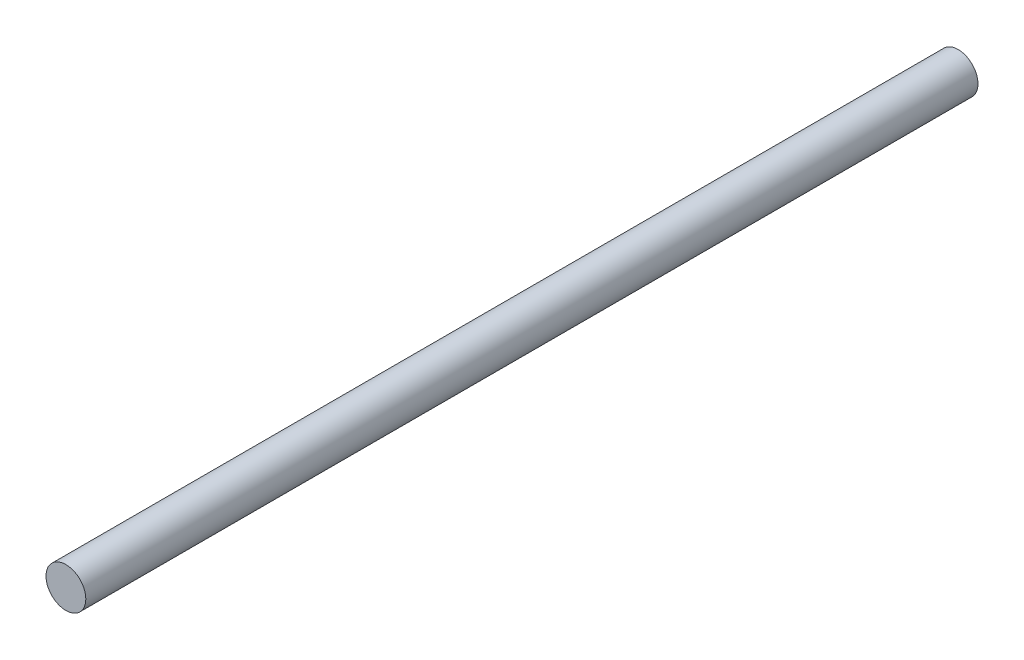
ISO-10303-21;
HEADER;
FILE_DESCRIPTION(('STEP AP214'),'2;1');
FILE_NAME('part.step','',(''),(''),'','','');
FILE_SCHEMA(('AUTOMOTIVE_DESIGN { 1 0 10303 214 1 1 1 1 }'));
ENDSEC;
DATA;
#1=APPLICATION_CONTEXT('core data for automotive mechanical design processes');
#2=APPLICATION_PROTOCOL_DEFINITION('international standard','automotive_design',2000,#1);
#3=PRODUCT_CONTEXT('',#1,'mechanical');
#4=PRODUCT('Part','Part','',(#3));
#5=PRODUCT_RELATED_PRODUCT_CATEGORY('part','',(#4));
#6=PRODUCT_DEFINITION_FORMATION('','',#4);
#7=PRODUCT_DEFINITION_CONTEXT('part definition',#1,'design');
#8=PRODUCT_DEFINITION('design','',#6,#7);
#9=PRODUCT_DEFINITION_SHAPE('','',#8);
#10=(LENGTH_UNIT() NAMED_UNIT(*) SI_UNIT(.MILLI.,.METRE.));
#11=(NAMED_UNIT(*) PLANE_ANGLE_UNIT() SI_UNIT($,.RADIAN.));
#12=(NAMED_UNIT(*) SI_UNIT($,.STERADIAN.) SOLID_ANGLE_UNIT());
#13=UNCERTAINTY_MEASURE_WITH_UNIT(LENGTH_MEASURE(1.E-05),#10,'distance_accuracy_value','');
#14=(GEOMETRIC_REPRESENTATION_CONTEXT(3) GLOBAL_UNCERTAINTY_ASSIGNED_CONTEXT((#13)) GLOBAL_UNIT_ASSIGNED_CONTEXT((#10,
#11,#12)) REPRESENTATION_CONTEXT('',''));
#15=CARTESIAN_POINT('',(0.,0.,0.));
#16=DIRECTION('',(0.,0.,1.));
#17=DIRECTION('',(1.,0.,0.));
#18=AXIS2_PLACEMENT_3D('',#15,#16,#17);
#19=CARTESIAN_POINT('',(0.,0.,49.3139206606353));
#20=DIRECTION('',(0.,0.,1.));
#21=DIRECTION('',(1.,0.,0.));
#22=AXIS2_PLACEMENT_3D('',#19,#20,#21);
#23=PLANE('',#22);
#24=CARTESIAN_POINT('',(0.,0.,49.3139206606353));
#25=DIRECTION('',(0.,0.,-1.));
#26=DIRECTION('',(-1.,0.,0.));
#27=AXIS2_PLACEMENT_3D('',#24,#25,#26);
#28=CIRCLE('',#27,2.2);
#29=CARTESIAN_POINT('',(-2.2,0.,49.3139206606353));
#30=VERTEX_POINT('',#29);
#31=EDGE_CURVE('E9',#30,#30,#28,.T.);
#32=ORIENTED_EDGE('',*,*,#31,.F.);
#33=EDGE_LOOP('',(#32));
#34=FACE_BOUND('',#33,.T.);
#35=ADVANCED_FACE('F14',(#34),#23,.T.);
#36=CARTESIAN_POINT('',(0.,0.,-49.3139206606353));
#37=DIRECTION('',(0.,0.,-1.));
#38=DIRECTION('',(-1.,0.,0.));
#39=AXIS2_PLACEMENT_3D('',#36,#37,#38);
#40=PLANE('',#39);
#41=CARTESIAN_POINT('',(0.,0.,-49.3139206606353));
#42=DIRECTION('',(0.,0.,1.));
#43=DIRECTION('',(1.,0.,0.));
#44=AXIS2_PLACEMENT_3D('',#41,#42,#43);
#45=CIRCLE('',#44,2.2);
#46=CARTESIAN_POINT('',(2.2,0.,-49.3139206606353));
#47=VERTEX_POINT('',#46);
#48=EDGE_CURVE('E21',#47,#47,#45,.T.);
#49=ORIENTED_EDGE('',*,*,#48,.F.);
#50=EDGE_LOOP('',(#49));
#51=FACE_BOUND('',#50,.T.);
#52=ADVANCED_FACE('F29',(#51),#40,.T.);
#53=CARTESIAN_POINT('',(0.,0.,-49.3139206606353));
#54=DIRECTION('',(0.,0.,1.));
#55=DIRECTION('',(1.,0.,0.));
#56=AXIS2_PLACEMENT_3D('',#53,#54,#55);
#57=CYLINDRICAL_SURFACE('',#56,2.2);
#58=ORIENTED_EDGE('',*,*,#31,.T.);
#59=EDGE_LOOP('',(#58));
#60=FACE_BOUND('',#59,.T.);
#61=ORIENTED_EDGE('',*,*,#48,.T.);
#62=EDGE_LOOP('',(#61));
#63=FACE_BOUND('',#62,.T.);
#64=ADVANCED_FACE('F16',(#60,#63),#57,.T.);
#65=CLOSED_SHELL('',(#35,#52,#64));
#66=MANIFOLD_SOLID_BREP('B1',#65);
#67=ADVANCED_BREP_SHAPE_REPRESENTATION('',(#18,#66),#14);
#68=SHAPE_DEFINITION_REPRESENTATION(#9,#67);
ENDSEC;
END-ISO-10303-21;
